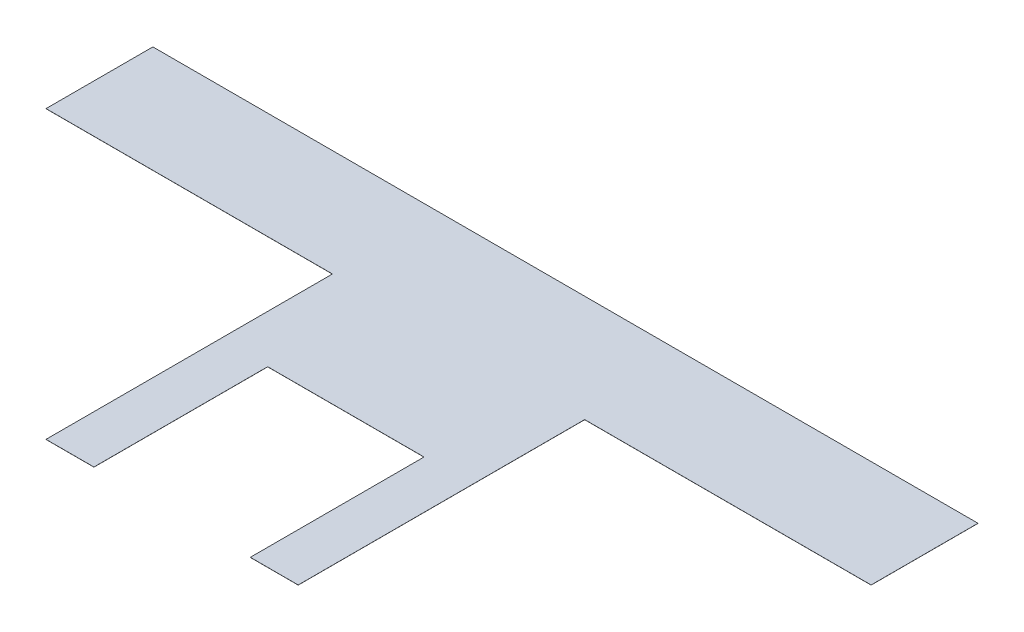
ISO-10303-21;
HEADER;
FILE_DESCRIPTION(('STEP AP214'),'2;1');
FILE_NAME('part.step','',(''),(''),'','','');
FILE_SCHEMA(('AUTOMOTIVE_DESIGN { 1 0 10303 214 1 1 1 1 }'));
ENDSEC;
DATA;
#1=APPLICATION_CONTEXT('core data for automotive mechanical design processes');
#2=APPLICATION_PROTOCOL_DEFINITION('international standard','automotive_design',2000,#1);
#3=PRODUCT_CONTEXT('',#1,'mechanical');
#4=PRODUCT('Part','Part','',(#3));
#5=PRODUCT_RELATED_PRODUCT_CATEGORY('part','',(#4));
#6=PRODUCT_DEFINITION_FORMATION('','',#4);
#7=PRODUCT_DEFINITION_CONTEXT('part definition',#1,'design');
#8=PRODUCT_DEFINITION('design','',#6,#7);
#9=PRODUCT_DEFINITION_SHAPE('','',#8);
#10=(LENGTH_UNIT() NAMED_UNIT(*) SI_UNIT(.MILLI.,.METRE.));
#11=(NAMED_UNIT(*) PLANE_ANGLE_UNIT() SI_UNIT($,.RADIAN.));
#12=(NAMED_UNIT(*) SI_UNIT($,.STERADIAN.) SOLID_ANGLE_UNIT());
#13=UNCERTAINTY_MEASURE_WITH_UNIT(LENGTH_MEASURE(1.E-05),#10,'distance_accuracy_value','');
#14=(GEOMETRIC_REPRESENTATION_CONTEXT(3) GLOBAL_UNCERTAINTY_ASSIGNED_CONTEXT((#13)) GLOBAL_UNIT_ASSIGNED_CONTEXT((#10,
#11,#12)) REPRESENTATION_CONTEXT('',''));
#15=CARTESIAN_POINT('',(0.,0.,0.));
#16=DIRECTION('',(0.,0.,1.));
#17=DIRECTION('',(1.,0.,0.));
#18=AXIS2_PLACEMENT_3D('',#15,#16,#17);
#19=CARTESIAN_POINT('',(0.,-1.27,-1250.));
#20=DIRECTION('',(0.,0.,-1.));
#21=DIRECTION('',(-1.,0.,0.));
#22=AXIS2_PLACEMENT_3D('',#19,#20,#21);
#23=PLANE('',#22);
#24=DIRECTION('',(-1.,0.,0.));
#25=VECTOR('',#24,1.);
#26=CARTESIAN_POINT('',(0.,0.,-1250.));
#27=LINE('',#26,#25);
#28=CARTESIAN_POINT('',(3350.14790424183,2.35271871429354E-11,-1250.));
#29=VERTEX_POINT('',#28);
#30=CARTESIAN_POINT('',(-6300.14790424183,2.30926389122033E-11,-1250.));
#31=VERTEX_POINT('',#30);
#32=EDGE_CURVE('E179',#29,#31,#27,.T.);
#33=ORIENTED_EDGE('',*,*,#32,.F.);
#34=DIRECTION('',(0.,-1.,0.));
#35=VECTOR('',#34,1.);
#36=CARTESIAN_POINT('',(3350.14790424183,2.35271871429354E-11,-1250.));
#37=LINE('',#36,#35);
#38=CARTESIAN_POINT('',(3350.14790424183,-1.26999999997647,-1250.));
#39=VERTEX_POINT('',#38);
#40=EDGE_CURVE('E273',#29,#39,#37,.T.);
#41=ORIENTED_EDGE('',*,*,#40,.T.);
#42=DIRECTION('',(-1.,0.,0.));
#43=VECTOR('',#42,1.);
#44=CARTESIAN_POINT('',(0.,-1.27,-1250.));
#45=LINE('',#44,#43);
#46=CARTESIAN_POINT('',(-6300.14790424183,-1.26999999997679,-1250.));
#47=VERTEX_POINT('',#46);
#48=EDGE_CURVE('E195',#39,#47,#45,.T.);
#49=ORIENTED_EDGE('',*,*,#48,.T.);
#50=DIRECTION('',(0.,-1.,0.));
#51=VECTOR('',#50,1.);
#52=CARTESIAN_POINT('',(-6300.14790424183,2.30926389122033E-11,-1250.));
#53=LINE('',#52,#51);
#54=EDGE_CURVE('E287',#31,#47,#53,.T.);
#55=ORIENTED_EDGE('',*,*,#54,.F.);
#56=EDGE_LOOP('',(#33,#41,#49,#55));
#57=FACE_BOUND('',#56,.T.);
#58=ADVANCED_FACE('F155',(#57),#23,.T.);
#59=CARTESIAN_POINT('',(0.,-1.27,0.));
#60=DIRECTION('',(0.,1.,0.));
#61=DIRECTION('',(0.,0.,1.));
#62=AXIS2_PLACEMENT_3D('',#59,#60,#61);
#63=PLANE('',#62);
#64=ORIENTED_EDGE('',*,*,#48,.F.);
#65=DIRECTION('',(0.,0.,-1.));
#66=VECTOR('',#65,1.);
#67=CARTESIAN_POINT('',(3350.14790424183,-1.26999999997647,0.));
#68=LINE('',#67,#66);
#69=CARTESIAN_POINT('',(3350.14790424183,-1.26999999997647,6.97174601755765E-13));
#70=VERTEX_POINT('',#69);
#71=EDGE_CURVE('E277',#39,#70,#68,.F.);
#72=ORIENTED_EDGE('',*,*,#71,.T.);
#73=DIRECTION('',(1.,0.,0.));
#74=VECTOR('',#73,1.);
#75=CARTESIAN_POINT('',(1.07725212091594,-1.27,-2.22044604925031E-13));
#76=LINE('',#75,#74);
#77=CARTESIAN_POINT('',(0.,-1.27,3.55184631706251E-13));
#78=VERTEX_POINT('',#77);
#79=EDGE_CURVE('E217',#70,#78,#76,.F.);
#80=ORIENTED_EDGE('',*,*,#79,.T.);
#81=DIRECTION('',(0.,0.,-1.));
#82=VECTOR('',#81,1.);
#83=CARTESIAN_POINT('',(0.,-1.27,1.07725212091612));
#84=LINE('',#83,#82);
#85=CARTESIAN_POINT('',(4.03247037924362E-13,-1.26999999997662,3350.14790424183));
#86=VERTEX_POINT('',#85);
#87=EDGE_CURVE('E226',#78,#86,#84,.F.);
#88=ORIENTED_EDGE('',*,*,#87,.T.);
#89=DIRECTION('',(1.,0.,0.));
#90=VECTOR('',#89,1.);
#91=CARTESIAN_POINT('',(4.03247037924362E-13,-1.26999999997662,3350.14790424183));
#92=LINE('',#91,#90);
#93=CARTESIAN_POINT('',(-560.599999999998,-1.26999999997663,3350.14790424183));
#94=VERTEX_POINT('',#93);
#95=EDGE_CURVE('E324',#86,#94,#92,.F.);
#96=ORIENTED_EDGE('',*,*,#95,.T.);
#97=DIRECTION('',(0.,0.,1.));
#98=VECTOR('',#97,1.);
#99=CARTESIAN_POINT('',(-560.599999999998,-1.26999999997663,3350.14790424183));
#100=LINE('',#99,#98);
#101=CARTESIAN_POINT('',(-560.6,-1.26999999999083,1318.14790424183));
#102=VERTEX_POINT('',#101);
#103=EDGE_CURVE('E338',#102,#94,#100,.T.);
#104=ORIENTED_EDGE('',*,*,#103,.F.);
#105=DIRECTION('',(1.,0.,0.));
#106=VECTOR('',#105,1.);
#107=CARTESIAN_POINT('',(-560.6,-1.26999999999083,1318.14790424183));
#108=LINE('',#107,#106);
#109=CARTESIAN_POINT('',(-2389.4,-1.26999999999105,1318.14790424183));
#110=VERTEX_POINT('',#109);
#111=EDGE_CURVE('E345',#110,#102,#108,.T.);
#112=ORIENTED_EDGE('',*,*,#111,.F.);
#113=DIRECTION('',(0.,0.,-1.));
#114=VECTOR('',#113,1.);
#115=CARTESIAN_POINT('',(-2389.4,-1.26999999997663,3350.14790424183));
#116=LINE('',#115,#114);
#117=CARTESIAN_POINT('',(-2389.4,-1.26999999997708,3350.14790424183));
#118=VERTEX_POINT('',#117);
#119=EDGE_CURVE('E352',#118,#110,#116,.T.);
#120=ORIENTED_EDGE('',*,*,#119,.F.);
#121=CARTESIAN_POINT('',(-2950.,-1.26999999997662,3350.14790424183));
#122=VERTEX_POINT('',#121);
#123=EDGE_CURVE('E308',#118,#122,#92,.F.);
#124=ORIENTED_EDGE('',*,*,#123,.T.);
#125=DIRECTION('',(0.,0.,-1.));
#126=VECTOR('',#125,1.);
#127=CARTESIAN_POINT('',(-2950.,-1.27,1.07725212091612));
#128=LINE('',#127,#126);
#129=CARTESIAN_POINT('',(-2950.,-1.27,3.55184631706251E-13));
#130=VERTEX_POINT('',#129);
#131=EDGE_CURVE('E305',#122,#130,#128,.T.);
#132=ORIENTED_EDGE('',*,*,#131,.T.);
#133=DIRECTION('',(1.,0.,0.));
#134=VECTOR('',#133,1.);
#135=CARTESIAN_POINT('',(-2951.07725212092,-1.27,3.33066907387547E-13));
#136=LINE('',#135,#134);
#137=CARTESIAN_POINT('',(-6300.14790424183,-1.26999999997679,4.71001795554359E-13));
#138=VERTEX_POINT('',#137);
#139=EDGE_CURVE('E291',#130,#138,#136,.F.);
#140=ORIENTED_EDGE('',*,*,#139,.T.);
#141=DIRECTION('',(0.,0.,1.));
#142=VECTOR('',#141,1.);
#143=CARTESIAN_POINT('',(-6300.14790424183,-1.26999999997679,0.));
#144=LINE('',#143,#142);
#145=EDGE_CURVE('E285',#138,#47,#144,.F.);
#146=ORIENTED_EDGE('',*,*,#145,.T.);
#147=EDGE_LOOP('',(#64,#72,#80,#88,#96,#104,#112,#120,#124,#132,#140,#146));
#148=FACE_BOUND('',#147,.T.);
#149=ADVANCED_FACE('F302',(#148),#63,.F.);
#150=CARTESIAN_POINT('',(0.,0.,0.));
#151=DIRECTION('',(0.,1.,0.));
#152=DIRECTION('',(0.,0.,1.));
#153=AXIS2_PLACEMENT_3D('',#150,#151,#152);
#154=PLANE('',#153);
#155=DIRECTION('',(0.,0.,-1.));
#156=VECTOR('',#155,1.);
#157=CARTESIAN_POINT('',(0.,0.,1.07725212091612));
#158=LINE('',#157,#156);
#159=CARTESIAN_POINT('',(0.,0.,3.55184631706251E-13));
#160=VERTEX_POINT('',#159);
#161=CARTESIAN_POINT('',(4.03186644778813E-13,2.33784346048704E-11,3350.14790424183));
#162=VERTEX_POINT('',#161);
#163=EDGE_CURVE('E261',#160,#162,#158,.F.);
#164=ORIENTED_EDGE('',*,*,#163,.F.);
#165=DIRECTION('',(1.,0.,0.));
#166=VECTOR('',#165,1.);
#167=CARTESIAN_POINT('',(1.07725212091594,0.,-2.22044604925031E-13));
#168=LINE('',#167,#166);
#169=CARTESIAN_POINT('',(3350.14790424183,2.35271871429354E-11,5.48961891569389E-13));
#170=VERTEX_POINT('',#169);
#171=EDGE_CURVE('E202',#170,#160,#168,.F.);
#172=ORIENTED_EDGE('',*,*,#171,.F.);
#173=DIRECTION('',(0.,0.,1.));
#174=VECTOR('',#173,1.);
#175=CARTESIAN_POINT('',(3350.14790424183,2.35271871429354E-11,5.48961891569388E-13));
#176=LINE('',#175,#174);
#177=EDGE_CURVE('E310',#29,#170,#176,.T.);
#178=ORIENTED_EDGE('',*,*,#177,.F.);
#179=ORIENTED_EDGE('',*,*,#32,.T.);
#180=DIRECTION('',(0.,0.,-1.));
#181=VECTOR('',#180,1.);
#182=CARTESIAN_POINT('',(-6300.14790424183,2.30926389122033E-11,-1250.));
#183=LINE('',#182,#181);
#184=CARTESIAN_POINT('',(-6300.14790424183,2.30926389122033E-11,6.52947281908993E-13));
#185=VERTEX_POINT('',#184);
#186=EDGE_CURVE('E275',#185,#31,#183,.T.);
#187=ORIENTED_EDGE('',*,*,#186,.F.);
#188=DIRECTION('',(1.,0.,0.));
#189=VECTOR('',#188,1.);
#190=CARTESIAN_POINT('',(-2951.07725212092,0.,3.33066907387547E-13));
#191=LINE('',#190,#189);
#192=CARTESIAN_POINT('',(-2950.,0.,3.33066907387547E-13));
#193=VERTEX_POINT('',#192);
#194=EDGE_CURVE('E284',#193,#185,#191,.F.);
#195=ORIENTED_EDGE('',*,*,#194,.F.);
#196=DIRECTION('',(0.,0.,-1.));
#197=VECTOR('',#196,1.);
#198=CARTESIAN_POINT('',(-2950.,0.,1.07725212091612));
#199=LINE('',#198,#197);
#200=CARTESIAN_POINT('',(-2950.,2.33788682857394E-11,3350.14790424183));
#201=VERTEX_POINT('',#200);
#202=EDGE_CURVE('E170',#201,#193,#199,.T.);
#203=ORIENTED_EDGE('',*,*,#202,.F.);
#204=DIRECTION('',(-1.,0.,0.));
#205=VECTOR('',#204,1.);
#206=CARTESIAN_POINT('',(-2950.,2.33788682857394E-11,3350.14790424183));
#207=LINE('',#206,#205);
#208=CARTESIAN_POINT('',(-2389.4,2.33788682857394E-11,3350.14790424183));
#209=VERTEX_POINT('',#208);
#210=EDGE_CURVE('E333',#209,#201,#207,.T.);
#211=ORIENTED_EDGE('',*,*,#210,.F.);
#212=DIRECTION('',(0.,0.,1.));
#213=VECTOR('',#212,1.);
#214=CARTESIAN_POINT('',(-2389.4,1.13945311519537E-11,3350.14790424183));
#215=LINE('',#214,#213);
#216=CARTESIAN_POINT('',(-2389.4,4.29994581607751E-12,1318.14790424183));
#217=VERTEX_POINT('',#216);
#218=EDGE_CURVE('E348',#217,#209,#215,.T.);
#219=ORIENTED_EDGE('',*,*,#218,.F.);
#220=DIRECTION('',(-1.,0.,0.));
#221=VECTOR('',#220,1.);
#222=CARTESIAN_POINT('',(-560.6,4.51982201665757E-12,1318.14790424183));
#223=LINE('',#222,#221);
#224=CARTESIAN_POINT('',(-560.6,4.51982201665757E-12,1318.14790424183));
#225=VERTEX_POINT('',#224);
#226=EDGE_CURVE('E340',#225,#217,#223,.T.);
#227=ORIENTED_EDGE('',*,*,#226,.F.);
#228=DIRECTION('',(0.,0.,-1.));
#229=VECTOR('',#228,1.);
#230=CARTESIAN_POINT('',(-560.599999999998,1.16148410334027E-11,3350.14790424183));
#231=LINE('',#230,#229);
#232=CARTESIAN_POINT('',(-560.599999999998,1.16148410334027E-11,3350.14790424183));
#233=VERTEX_POINT('',#232);
#234=EDGE_CURVE('E331',#233,#225,#231,.T.);
#235=ORIENTED_EDGE('',*,*,#234,.F.);
#236=EDGE_CURVE('E267',#162,#233,#207,.T.);
#237=ORIENTED_EDGE('',*,*,#236,.F.);
#238=EDGE_LOOP('',(#164,#172,#178,#179,#187,#195,#203,#211,#219,#227,#235,#237));
#239=FACE_BOUND('',#238,.T.);
#240=ADVANCED_FACE('F157',(#239),#154,.T.);
#241=CARTESIAN_POINT('',(-2951.07725212092,-0.635,3.33066907387547E-13));
#242=DIRECTION('',(0.,0.,-1.));
#243=DIRECTION('',(1.,0.,0.));
#244=AXIS2_PLACEMENT_3D('',#241,#242,#243);
#245=PLANE('',#244);
#246=DIRECTION('',(0.,1.,0.));
#247=VECTOR('',#246,1.);
#248=CARTESIAN_POINT('',(-2950.,-1.27,3.55147571752732E-13));
#249=LINE('',#248,#247);
#250=EDGE_CURVE('E13',#130,#193,#249,.T.);
#251=ORIENTED_EDGE('',*,*,#250,.T.);
#252=ORIENTED_EDGE('',*,*,#194,.T.);
#253=DIRECTION('',(0.,-1.,0.));
#254=VECTOR('',#253,1.);
#255=CARTESIAN_POINT('',(-6300.14790424183,2.30926389122033E-11,6.48551770953626E-13));
#256=LINE('',#255,#254);
#257=EDGE_CURVE('E281',#185,#138,#256,.T.);
#258=ORIENTED_EDGE('',*,*,#257,.T.);
#259=ORIENTED_EDGE('',*,*,#139,.F.);
#260=EDGE_LOOP('',(#251,#252,#258,#259));
#261=FACE_BOUND('',#260,.T.);
#262=ADVANCED_FACE('F297',(#261),#245,.F.);
#263=CARTESIAN_POINT('',(-6300.14790424183,2.30926389122033E-11,-1250.));
#264=DIRECTION('',(-1.,0.,0.));
#265=DIRECTION('',(0.,-1.,0.));
#266=AXIS2_PLACEMENT_3D('',#263,#264,#265);
#267=PLANE('',#266);
#268=ORIENTED_EDGE('',*,*,#145,.F.);
#269=ORIENTED_EDGE('',*,*,#257,.F.);
#270=ORIENTED_EDGE('',*,*,#186,.T.);
#271=ORIENTED_EDGE('',*,*,#54,.T.);
#272=EDGE_LOOP('',(#268,#269,#270,#271));
#273=FACE_BOUND('',#272,.T.);
#274=ADVANCED_FACE('F301',(#273),#267,.T.);
#275=CARTESIAN_POINT('',(1.07725212091594,-0.635,-2.22044604925031E-13));
#276=DIRECTION('',(0.,0.,-1.));
#277=DIRECTION('',(1.,0.,0.));
#278=AXIS2_PLACEMENT_3D('',#275,#276,#277);
#279=PLANE('',#278);
#280=ORIENTED_EDGE('',*,*,#171,.T.);
#281=DIRECTION('',(0.,1.,0.));
#282=VECTOR('',#281,1.);
#283=CARTESIAN_POINT('',(0.,-1.27,0.));
#284=LINE('',#283,#282);
#285=EDGE_CURVE('E163',#78,#160,#284,.T.);
#286=ORIENTED_EDGE('',*,*,#285,.F.);
#287=ORIENTED_EDGE('',*,*,#79,.F.);
#288=DIRECTION('',(0.,-1.,0.));
#289=VECTOR('',#288,1.);
#290=CARTESIAN_POINT('',(3350.14790424183,2.35271871429354E-11,5.48961891569388E-13));
#291=LINE('',#290,#289);
#292=EDGE_CURVE('E271',#170,#70,#291,.T.);
#293=ORIENTED_EDGE('',*,*,#292,.F.);
#294=EDGE_LOOP('',(#280,#286,#287,#293));
#295=FACE_BOUND('',#294,.T.);
#296=ADVANCED_FACE('F270',(#295),#279,.F.);
#297=CARTESIAN_POINT('',(3350.14790424183,2.35271871429354E-11,5.48961891569388E-13));
#298=DIRECTION('',(1.,0.,0.));
#299=DIRECTION('',(0.,1.,0.));
#300=AXIS2_PLACEMENT_3D('',#297,#298,#299);
#301=PLANE('',#300);
#302=ORIENTED_EDGE('',*,*,#71,.F.);
#303=ORIENTED_EDGE('',*,*,#40,.F.);
#304=ORIENTED_EDGE('',*,*,#177,.T.);
#305=ORIENTED_EDGE('',*,*,#292,.T.);
#306=EDGE_LOOP('',(#302,#303,#304,#305));
#307=FACE_BOUND('',#306,.T.);
#308=ADVANCED_FACE('F319',(#307),#301,.T.);
#309=CARTESIAN_POINT('',(0.,-0.635,1.07725212091612));
#310=DIRECTION('',(-1.,0.,0.));
#311=DIRECTION('',(0.,0.,-1.));
#312=AXIS2_PLACEMENT_3D('',#309,#310,#311);
#313=PLANE('',#312);
#314=ORIENTED_EDGE('',*,*,#285,.T.);
#315=ORIENTED_EDGE('',*,*,#163,.T.);
#316=DIRECTION('',(0.,-1.,0.));
#317=VECTOR('',#316,1.);
#318=CARTESIAN_POINT('',(4.03247037924362E-13,2.33784346048704E-11,3350.14790424183));
#319=LINE('',#318,#317);
#320=EDGE_CURVE('E268',#162,#86,#319,.T.);
#321=ORIENTED_EDGE('',*,*,#320,.T.);
#322=ORIENTED_EDGE('',*,*,#87,.F.);
#323=EDGE_LOOP('',(#314,#315,#321,#322));
#324=FACE_BOUND('',#323,.T.);
#325=ADVANCED_FACE('F263',(#324),#313,.F.);
#326=CARTESIAN_POINT('',(-2950.,-0.635,1.07725212091612));
#327=DIRECTION('',(-1.,0.,0.));
#328=DIRECTION('',(0.,0.,-1.));
#329=AXIS2_PLACEMENT_3D('',#326,#327,#328);
#330=PLANE('',#329);
#331=ORIENTED_EDGE('',*,*,#202,.T.);
#332=ORIENTED_EDGE('',*,*,#250,.F.);
#333=ORIENTED_EDGE('',*,*,#131,.F.);
#334=DIRECTION('',(0.,-1.,0.));
#335=VECTOR('',#334,1.);
#336=CARTESIAN_POINT('',(-2950.,2.33788682857394E-11,3350.14790424183));
#337=LINE('',#336,#335);
#338=EDGE_CURVE('E355',#201,#122,#337,.T.);
#339=ORIENTED_EDGE('',*,*,#338,.F.);
#340=EDGE_LOOP('',(#331,#332,#333,#339));
#341=FACE_BOUND('',#340,.T.);
#342=ADVANCED_FACE('F363',(#341),#330,.T.);
#343=CARTESIAN_POINT('',(-2950.,2.33788682857394E-11,3350.14790424183));
#344=DIRECTION('',(0.,0.,1.));
#345=DIRECTION('',(0.,-1.,0.));
#346=AXIS2_PLACEMENT_3D('',#343,#344,#345);
#347=PLANE('',#346);
#348=DIRECTION('',(0.,1.,0.));
#349=VECTOR('',#348,1.);
#350=CARTESIAN_POINT('',(-2389.4,-1252.00759999999,3350.14790424184));
#351=LINE('',#350,#349);
#352=EDGE_CURVE('E356',#118,#209,#351,.T.);
#353=ORIENTED_EDGE('',*,*,#352,.T.);
#354=ORIENTED_EDGE('',*,*,#210,.T.);
#355=ORIENTED_EDGE('',*,*,#338,.T.);
#356=ORIENTED_EDGE('',*,*,#123,.F.);
#357=EDGE_LOOP('',(#353,#354,#355,#356));
#358=FACE_BOUND('',#357,.T.);
#359=ADVANCED_FACE('F361',(#358),#347,.T.);
#360=CARTESIAN_POINT('',(-2389.4,-1252.00759999999,3350.14790424184));
#361=DIRECTION('',(-1.,0.,0.));
#362=DIRECTION('',(0.,1.,0.));
#363=AXIS2_PLACEMENT_3D('',#360,#361,#362);
#364=PLANE('',#363);
#365=ORIENTED_EDGE('',*,*,#119,.T.);
#366=DIRECTION('',(0.,1.,0.));
#367=VECTOR('',#366,1.);
#368=CARTESIAN_POINT('',(-2389.4,-1252.0076,1318.14790424184));
#369=LINE('',#368,#367);
#370=EDGE_CURVE('E350',#110,#217,#369,.T.);
#371=ORIENTED_EDGE('',*,*,#370,.T.);
#372=ORIENTED_EDGE('',*,*,#218,.T.);
#373=ORIENTED_EDGE('',*,*,#352,.F.);
#374=EDGE_LOOP('',(#365,#371,#372,#373));
#375=FACE_BOUND('',#374,.T.);
#376=ADVANCED_FACE('F370',(#375),#364,.F.);
#377=CARTESIAN_POINT('',(-560.6,-1252.0076,1318.14790424184));
#378=DIRECTION('',(0.,0.,-1.));
#379=DIRECTION('',(-1.,0.,0.));
#380=AXIS2_PLACEMENT_3D('',#377,#378,#379);
#381=PLANE('',#380);
#382=ORIENTED_EDGE('',*,*,#111,.T.);
#383=DIRECTION('',(0.,1.,0.));
#384=VECTOR('',#383,1.);
#385=CARTESIAN_POINT('',(-560.6,-1252.0076,1318.14790424184));
#386=LINE('',#385,#384);
#387=EDGE_CURVE('E343',#102,#225,#386,.T.);
#388=ORIENTED_EDGE('',*,*,#387,.T.);
#389=ORIENTED_EDGE('',*,*,#226,.T.);
#390=ORIENTED_EDGE('',*,*,#370,.F.);
#391=EDGE_LOOP('',(#382,#388,#389,#390));
#392=FACE_BOUND('',#391,.T.);
#393=ADVANCED_FACE('F416',(#392),#381,.F.);
#394=CARTESIAN_POINT('',(-560.599999999998,-1252.00759999999,3350.14790424184));
#395=DIRECTION('',(1.,0.,0.));
#396=DIRECTION('',(0.,0.,-1.));
#397=AXIS2_PLACEMENT_3D('',#394,#395,#396);
#398=PLANE('',#397);
#399=ORIENTED_EDGE('',*,*,#103,.T.);
#400=DIRECTION('',(0.,1.,0.));
#401=VECTOR('',#400,1.);
#402=CARTESIAN_POINT('',(-560.599999999998,-1252.00759999999,3350.14790424184));
#403=LINE('',#402,#401);
#404=EDGE_CURVE('E329',#94,#233,#403,.T.);
#405=ORIENTED_EDGE('',*,*,#404,.T.);
#406=ORIENTED_EDGE('',*,*,#234,.T.);
#407=ORIENTED_EDGE('',*,*,#387,.F.);
#408=EDGE_LOOP('',(#399,#405,#406,#407));
#409=FACE_BOUND('',#408,.T.);
#410=ADVANCED_FACE('F427',(#409),#398,.F.);
#411=ORIENTED_EDGE('',*,*,#404,.F.);
#412=ORIENTED_EDGE('',*,*,#95,.F.);
#413=ORIENTED_EDGE('',*,*,#320,.F.);
#414=ORIENTED_EDGE('',*,*,#236,.T.);
#415=EDGE_LOOP('',(#411,#412,#413,#414));
#416=FACE_BOUND('',#415,.T.);
#417=ADVANCED_FACE('F328',(#416),#347,.T.);
#418=CLOSED_SHELL('',(#58,#149,#240,#262,#274,#296,#308,#325,#342,#359,#376,#393,#410,#417));
#419=MANIFOLD_SOLID_BREP('B2',#418);
#420=ADVANCED_BREP_SHAPE_REPRESENTATION('',(#18,#419),#14);
#421=SHAPE_DEFINITION_REPRESENTATION(#9,#420);
ENDSEC;
END-ISO-10303-21;
